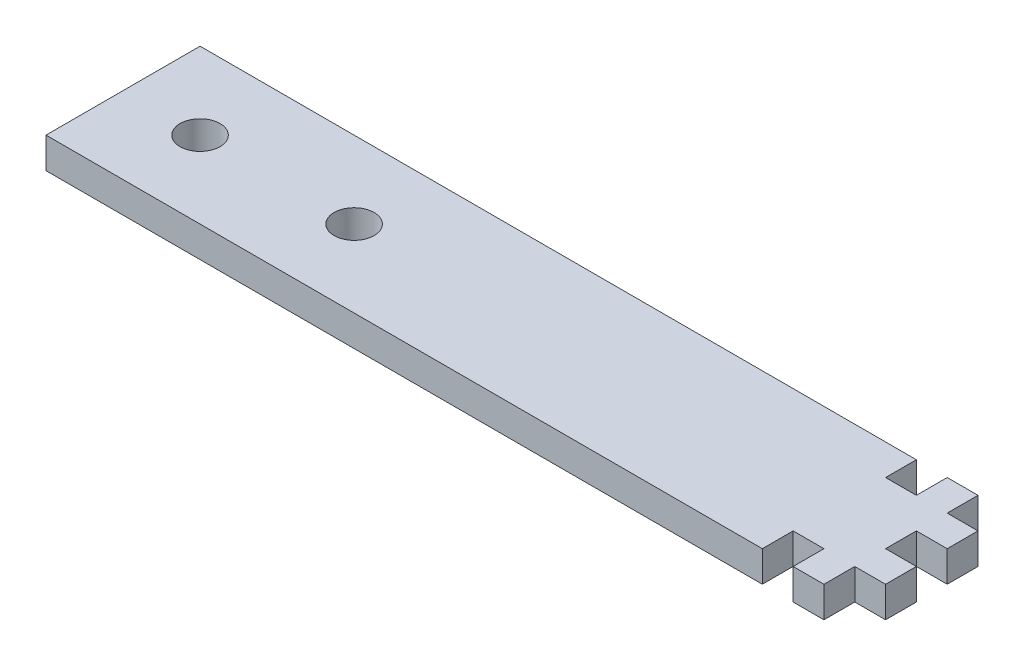
ISO-10303-21;
HEADER;
FILE_DESCRIPTION(('STEP AP214'),'2;1');
FILE_NAME('part.step','',(''),(''),'','','');
FILE_SCHEMA(('AUTOMOTIVE_DESIGN { 1 0 10303 214 1 1 1 1 }'));
ENDSEC;
DATA;
#1=APPLICATION_CONTEXT('core data for automotive mechanical design processes');
#2=APPLICATION_PROTOCOL_DEFINITION('international standard','automotive_design',2000,#1);
#3=PRODUCT_CONTEXT('',#1,'mechanical');
#4=PRODUCT('Part','Part','',(#3));
#5=PRODUCT_RELATED_PRODUCT_CATEGORY('part','',(#4));
#6=PRODUCT_DEFINITION_FORMATION('','',#4);
#7=PRODUCT_DEFINITION_CONTEXT('part definition',#1,'design');
#8=PRODUCT_DEFINITION('design','',#6,#7);
#9=PRODUCT_DEFINITION_SHAPE('','',#8);
#10=(LENGTH_UNIT() NAMED_UNIT(*) SI_UNIT(.MILLI.,.METRE.));
#11=(NAMED_UNIT(*) PLANE_ANGLE_UNIT() SI_UNIT($,.RADIAN.));
#12=(NAMED_UNIT(*) SI_UNIT($,.STERADIAN.) SOLID_ANGLE_UNIT());
#13=UNCERTAINTY_MEASURE_WITH_UNIT(LENGTH_MEASURE(1.E-05),#10,'distance_accuracy_value','');
#14=(GEOMETRIC_REPRESENTATION_CONTEXT(3) GLOBAL_UNCERTAINTY_ASSIGNED_CONTEXT((#13)) GLOBAL_UNIT_ASSIGNED_CONTEXT((#10,
#11,#12)) REPRESENTATION_CONTEXT('',''));
#15=CARTESIAN_POINT('',(0.,0.,0.));
#16=DIRECTION('',(0.,0.,1.));
#17=DIRECTION('',(1.,0.,0.));
#18=AXIS2_PLACEMENT_3D('',#15,#16,#17);
#19=CARTESIAN_POINT('',(0.,2.54,-12.7));
#20=DIRECTION('',(0.,0.,1.));
#21=DIRECTION('',(1.,0.,0.));
#22=AXIS2_PLACEMENT_3D('',#19,#20,#21);
#23=PLANE('',#22);
#24=DIRECTION('',(-1.,0.,0.));
#25=VECTOR('',#24,1.);
#26=CARTESIAN_POINT('',(0.,2.54,-12.7));
#27=LINE('',#26,#25);
#28=CARTESIAN_POINT('',(59.055,2.54,-12.7));
#29=VERTEX_POINT('',#28);
#30=CARTESIAN_POINT('',(0.,2.54,-12.7));
#31=VERTEX_POINT('',#30);
#32=EDGE_CURVE('E330',#29,#31,#27,.T.);
#33=ORIENTED_EDGE('',*,*,#32,.F.);
#34=DIRECTION('',(0.,1.,0.));
#35=VECTOR('',#34,1.);
#36=CARTESIAN_POINT('',(59.055,0.,-12.7));
#37=LINE('',#36,#35);
#38=CARTESIAN_POINT('',(59.055,0.,-12.7));
#39=VERTEX_POINT('',#38);
#40=EDGE_CURVE('E215',#39,#29,#37,.T.);
#41=ORIENTED_EDGE('',*,*,#40,.F.);
#42=DIRECTION('',(-1.,0.,0.));
#43=VECTOR('',#42,1.);
#44=CARTESIAN_POINT('',(0.,0.,-12.7));
#45=LINE('',#44,#43);
#46=CARTESIAN_POINT('',(0.,0.,-12.7));
#47=VERTEX_POINT('',#46);
#48=EDGE_CURVE('E207',#39,#47,#45,.T.);
#49=ORIENTED_EDGE('',*,*,#48,.T.);
#50=DIRECTION('',(0.,-1.,0.));
#51=VECTOR('',#50,1.);
#52=CARTESIAN_POINT('',(0.,2.54,-12.7));
#53=LINE('',#52,#51);
#54=EDGE_CURVE('E54',#31,#47,#53,.T.);
#55=ORIENTED_EDGE('',*,*,#54,.F.);
#56=EDGE_LOOP('',(#33,#41,#49,#55));
#57=FACE_BOUND('',#56,.T.);
#58=ADVANCED_FACE('F46',(#57),#23,.F.);
#59=CARTESIAN_POINT('',(0.,2.54,0.));
#60=DIRECTION('',(0.,0.,-1.));
#61=DIRECTION('',(-1.,0.,0.));
#62=AXIS2_PLACEMENT_3D('',#59,#60,#61);
#63=PLANE('',#62);
#64=DIRECTION('',(1.,0.,0.));
#65=VECTOR('',#64,1.);
#66=CARTESIAN_POINT('',(0.,2.54,0.));
#67=LINE('',#66,#65);
#68=CARTESIAN_POINT('',(61.595,2.54,0.));
#69=VERTEX_POINT('',#68);
#70=CARTESIAN_POINT('',(64.135,2.54,0.));
#71=VERTEX_POINT('',#70);
#72=EDGE_CURVE('E321',#69,#71,#67,.T.);
#73=ORIENTED_EDGE('',*,*,#72,.F.);
#74=DIRECTION('',(0.,1.,0.));
#75=VECTOR('',#74,1.);
#76=CARTESIAN_POINT('',(61.595,0.,0.));
#77=LINE('',#76,#75);
#78=CARTESIAN_POINT('',(61.595,0.,0.));
#79=VERTEX_POINT('',#78);
#80=EDGE_CURVE('E237',#79,#69,#77,.T.);
#81=ORIENTED_EDGE('',*,*,#80,.F.);
#82=DIRECTION('',(1.,0.,0.));
#83=VECTOR('',#82,1.);
#84=CARTESIAN_POINT('',(0.,0.,0.));
#85=LINE('',#84,#83);
#86=CARTESIAN_POINT('',(64.135,0.,0.));
#87=VERTEX_POINT('',#86);
#88=EDGE_CURVE('E336',#79,#87,#85,.T.);
#89=ORIENTED_EDGE('',*,*,#88,.T.);
#90=DIRECTION('',(0.,1.,0.));
#91=VECTOR('',#90,1.);
#92=CARTESIAN_POINT('',(64.135,0.,0.));
#93=LINE('',#92,#91);
#94=EDGE_CURVE('E289',#87,#71,#93,.T.);
#95=ORIENTED_EDGE('',*,*,#94,.T.);
#96=EDGE_LOOP('',(#73,#81,#89,#95));
#97=FACE_BOUND('',#96,.T.);
#98=ADVANCED_FACE('F358',(#97),#63,.F.);
#99=CARTESIAN_POINT('',(66.675,2.54,0.));
#100=DIRECTION('',(-1.,0.,0.));
#101=DIRECTION('',(0.,0.,1.));
#102=AXIS2_PLACEMENT_3D('',#99,#100,#101);
#103=PLANE('',#102);
#104=DIRECTION('',(0.,-1.,0.));
#105=VECTOR('',#104,1.);
#106=CARTESIAN_POINT('',(66.675,3.81,-5.08));
#107=LINE('',#106,#105);
#108=CARTESIAN_POINT('',(66.675,2.54,-5.08));
#109=VERTEX_POINT('',#108);
#110=CARTESIAN_POINT('',(66.675,0.,-5.08));
#111=VERTEX_POINT('',#110);
#112=EDGE_CURVE('E271',#109,#111,#107,.T.);
#113=ORIENTED_EDGE('',*,*,#112,.F.);
#114=DIRECTION('',(0.,0.,-1.));
#115=VECTOR('',#114,1.);
#116=CARTESIAN_POINT('',(66.675,2.54,0.));
#117=LINE('',#116,#115);
#118=CARTESIAN_POINT('',(66.675,2.54,-2.54));
#119=VERTEX_POINT('',#118);
#120=EDGE_CURVE('E327',#119,#109,#117,.T.);
#121=ORIENTED_EDGE('',*,*,#120,.F.);
#122=DIRECTION('',(0.,1.,0.));
#123=VECTOR('',#122,1.);
#124=CARTESIAN_POINT('',(66.675,0.,-2.54));
#125=LINE('',#124,#123);
#126=CARTESIAN_POINT('',(66.675,0.,-2.54));
#127=VERTEX_POINT('',#126);
#128=EDGE_CURVE('E286',#127,#119,#125,.T.);
#129=ORIENTED_EDGE('',*,*,#128,.F.);
#130=DIRECTION('',(0.,0.,-1.));
#131=VECTOR('',#130,1.);
#132=CARTESIAN_POINT('',(66.675,0.,0.));
#133=LINE('',#132,#131);
#134=EDGE_CURVE('E341',#127,#111,#133,.T.);
#135=ORIENTED_EDGE('',*,*,#134,.T.);
#136=EDGE_LOOP('',(#113,#121,#129,#135));
#137=FACE_BOUND('',#136,.T.);
#138=ADVANCED_FACE('F364',(#137),#103,.F.);
#139=DIRECTION('',(0.,-1.,0.));
#140=VECTOR('',#139,1.);
#141=CARTESIAN_POINT('',(66.675,3.81,-7.62));
#142=LINE('',#141,#140);
#143=CARTESIAN_POINT('',(66.675,2.54,-7.62));
#144=VERTEX_POINT('',#143);
#145=CARTESIAN_POINT('',(66.675,0.,-7.62));
#146=VERTEX_POINT('',#145);
#147=EDGE_CURVE('E268',#144,#146,#142,.T.);
#148=ORIENTED_EDGE('',*,*,#147,.T.);
#149=CARTESIAN_POINT('',(66.675,0.,-10.16));
#150=VERTEX_POINT('',#149);
#151=EDGE_CURVE('E340',#146,#150,#133,.T.);
#152=ORIENTED_EDGE('',*,*,#151,.T.);
#153=DIRECTION('',(0.,-1.,0.));
#154=VECTOR('',#153,1.);
#155=CARTESIAN_POINT('',(66.675,3.81,-10.16));
#156=LINE('',#155,#154);
#157=CARTESIAN_POINT('',(66.675,2.54,-10.16));
#158=VERTEX_POINT('',#157);
#159=EDGE_CURVE('E307',#158,#150,#156,.T.);
#160=ORIENTED_EDGE('',*,*,#159,.F.);
#161=EDGE_CURVE('E326',#144,#158,#117,.T.);
#162=ORIENTED_EDGE('',*,*,#161,.F.);
#163=EDGE_LOOP('',(#148,#152,#160,#162));
#164=FACE_BOUND('',#163,.T.);
#165=ADVANCED_FACE('F388',(#164),#103,.F.);
#166=CARTESIAN_POINT('',(0.,2.54,0.));
#167=DIRECTION('',(0.,-1.,0.));
#168=DIRECTION('',(0.,0.,-1.));
#169=AXIS2_PLACEMENT_3D('',#166,#167,#168);
#170=PLANE('',#169);
#171=CARTESIAN_POINT('',(19.05,2.54,-6.35));
#172=DIRECTION('',(0.,1.,0.));
#173=DIRECTION('',(0.,0.,1.));
#174=AXIS2_PLACEMENT_3D('',#171,#172,#173);
#175=CIRCLE('',#174,1.651);
#176=CARTESIAN_POINT('',(19.05,2.54,-4.699));
#177=VERTEX_POINT('',#176);
#178=EDGE_CURVE('E239',#177,#177,#175,.T.);
#179=ORIENTED_EDGE('',*,*,#178,.F.);
#180=EDGE_LOOP('',(#179));
#181=FACE_BOUND('',#180,.T.);
#182=CARTESIAN_POINT('',(6.35,2.54,-6.35));
#183=DIRECTION('',(0.,1.,0.));
#184=DIRECTION('',(0.,0.,1.));
#185=AXIS2_PLACEMENT_3D('',#182,#183,#184);
#186=CIRCLE('',#185,1.651);
#187=CARTESIAN_POINT('',(6.35,2.54,-4.699));
#188=VERTEX_POINT('',#187);
#189=EDGE_CURVE('E248',#188,#188,#186,.T.);
#190=ORIENTED_EDGE('',*,*,#189,.F.);
#191=EDGE_LOOP('',(#190));
#192=FACE_BOUND('',#191,.T.);
#193=DIRECTION('',(1.,0.,0.));
#194=VECTOR('',#193,1.);
#195=CARTESIAN_POINT('',(59.055,2.54,-10.16));
#196=LINE('',#195,#194);
#197=CARTESIAN_POINT('',(59.055,2.54,-10.16));
#198=VERTEX_POINT('',#197);
#199=CARTESIAN_POINT('',(61.595,2.54,-10.16));
#200=VERTEX_POINT('',#199);
#201=EDGE_CURVE('E209',#198,#200,#196,.T.);
#202=ORIENTED_EDGE('',*,*,#201,.F.);
#203=DIRECTION('',(0.,0.,1.));
#204=VECTOR('',#203,1.);
#205=CARTESIAN_POINT('',(59.055,2.54,-12.7));
#206=LINE('',#205,#204);
#207=EDGE_CURVE('E189',#29,#198,#206,.T.);
#208=ORIENTED_EDGE('',*,*,#207,.F.);
#209=ORIENTED_EDGE('',*,*,#32,.T.);
#210=DIRECTION('',(0.,0.,1.));
#211=VECTOR('',#210,1.);
#212=CARTESIAN_POINT('',(0.,2.54,0.));
#213=LINE('',#212,#211);
#214=CARTESIAN_POINT('',(0.,2.54,0.));
#215=VERTEX_POINT('',#214);
#216=EDGE_CURVE('E318',#31,#215,#213,.T.);
#217=ORIENTED_EDGE('',*,*,#216,.T.);
#218=CARTESIAN_POINT('',(59.055,2.54,0.));
#219=VERTEX_POINT('',#218);
#220=EDGE_CURVE('E323',#215,#219,#67,.T.);
#221=ORIENTED_EDGE('',*,*,#220,.T.);
#222=DIRECTION('',(0.,0.,1.));
#223=VECTOR('',#222,1.);
#224=CARTESIAN_POINT('',(59.055,2.54,0.));
#225=LINE('',#224,#223);
#226=CARTESIAN_POINT('',(59.055,2.54,-2.54));
#227=VERTEX_POINT('',#226);
#228=EDGE_CURVE('E69',#227,#219,#225,.T.);
#229=ORIENTED_EDGE('',*,*,#228,.F.);
#230=DIRECTION('',(-1.,0.,0.));
#231=VECTOR('',#230,1.);
#232=CARTESIAN_POINT('',(61.595,2.54,-2.54));
#233=LINE('',#232,#231);
#234=CARTESIAN_POINT('',(61.595,2.54,-2.54));
#235=VERTEX_POINT('',#234);
#236=EDGE_CURVE('E233',#235,#227,#233,.T.);
#237=ORIENTED_EDGE('',*,*,#236,.F.);
#238=DIRECTION('',(0.,0.,-1.));
#239=VECTOR('',#238,1.);
#240=CARTESIAN_POINT('',(61.595,2.54,0.));
#241=LINE('',#240,#239);
#242=EDGE_CURVE('E217',#69,#235,#241,.T.);
#243=ORIENTED_EDGE('',*,*,#242,.F.);
#244=ORIENTED_EDGE('',*,*,#72,.T.);
#245=DIRECTION('',(0.,0.,1.));
#246=VECTOR('',#245,1.);
#247=CARTESIAN_POINT('',(64.135,2.54,0.));
#248=LINE('',#247,#246);
#249=CARTESIAN_POINT('',(64.135,2.54,-2.54));
#250=VERTEX_POINT('',#249);
#251=EDGE_CURVE('E288',#250,#71,#248,.T.);
#252=ORIENTED_EDGE('',*,*,#251,.F.);
#253=DIRECTION('',(-1.,0.,0.));
#254=VECTOR('',#253,1.);
#255=CARTESIAN_POINT('',(0.,2.54,-2.54));
#256=LINE('',#255,#254);
#257=EDGE_CURVE('E296',#119,#250,#256,.T.);
#258=ORIENTED_EDGE('',*,*,#257,.F.);
#259=ORIENTED_EDGE('',*,*,#120,.T.);
#260=DIRECTION('',(1.,0.,0.));
#261=VECTOR('',#260,1.);
#262=CARTESIAN_POINT('',(0.,2.54,-5.08));
#263=LINE('',#262,#261);
#264=CARTESIAN_POINT('',(64.135,2.54,-5.08));
#265=VERTEX_POINT('',#264);
#266=EDGE_CURVE('E277',#265,#109,#263,.T.);
#267=ORIENTED_EDGE('',*,*,#266,.F.);
#268=DIRECTION('',(0.,0.,1.));
#269=VECTOR('',#268,1.);
#270=CARTESIAN_POINT('',(64.135,2.54,0.));
#271=LINE('',#270,#269);
#272=CARTESIAN_POINT('',(64.135,2.54,-7.62));
#273=VERTEX_POINT('',#272);
#274=EDGE_CURVE('E279',#273,#265,#271,.T.);
#275=ORIENTED_EDGE('',*,*,#274,.F.);
#276=DIRECTION('',(-1.,0.,0.));
#277=VECTOR('',#276,1.);
#278=CARTESIAN_POINT('',(0.,2.54,-7.62));
#279=LINE('',#278,#277);
#280=EDGE_CURVE('E275',#144,#273,#279,.T.);
#281=ORIENTED_EDGE('',*,*,#280,.F.);
#282=ORIENTED_EDGE('',*,*,#161,.T.);
#283=DIRECTION('',(1.,0.,0.));
#284=VECTOR('',#283,1.);
#285=CARTESIAN_POINT('',(0.,2.54,-10.16));
#286=LINE('',#285,#284);
#287=CARTESIAN_POINT('',(64.135,2.54,-10.16));
#288=VERTEX_POINT('',#287);
#289=EDGE_CURVE('E312',#288,#158,#286,.T.);
#290=ORIENTED_EDGE('',*,*,#289,.F.);
#291=DIRECTION('',(0.,0.,1.));
#292=VECTOR('',#291,1.);
#293=CARTESIAN_POINT('',(64.135,2.54,0.));
#294=LINE('',#293,#292);
#295=CARTESIAN_POINT('',(64.135,2.54,-12.7));
#296=VERTEX_POINT('',#295);
#297=EDGE_CURVE('E315',#296,#288,#294,.T.);
#298=ORIENTED_EDGE('',*,*,#297,.F.);
#299=CARTESIAN_POINT('',(61.595,2.54,-12.7));
#300=VERTEX_POINT('',#299);
#301=EDGE_CURVE('E331',#296,#300,#27,.T.);
#302=ORIENTED_EDGE('',*,*,#301,.T.);
#303=DIRECTION('',(0.,0.,-1.));
#304=VECTOR('',#303,1.);
#305=CARTESIAN_POINT('',(61.595,2.54,-12.7));
#306=LINE('',#305,#304);
#307=EDGE_CURVE('E61',#200,#300,#306,.T.);
#308=ORIENTED_EDGE('',*,*,#307,.F.);
#309=EDGE_LOOP('',(#202,#208,#209,#217,#221,#229,#237,#243,#244,#252,#258,#259,#267,#275,#281,
#282,#290,#298,#302,#308));
#310=FACE_BOUND('',#309,.T.);
#311=ADVANCED_FACE('F356',(#181,#192,#310),#170,.F.);
#312=CARTESIAN_POINT('',(0.,0.,0.));
#313=DIRECTION('',(0.,-1.,0.));
#314=DIRECTION('',(0.,0.,-1.));
#315=AXIS2_PLACEMENT_3D('',#312,#313,#314);
#316=PLANE('',#315);
#317=DIRECTION('',(0.,0.,1.));
#318=VECTOR('',#317,1.);
#319=CARTESIAN_POINT('',(59.055,0.,-12.7));
#320=LINE('',#319,#318);
#321=CARTESIAN_POINT('',(59.055,0.,-10.16));
#322=VERTEX_POINT('',#321);
#323=EDGE_CURVE('E186',#39,#322,#320,.T.);
#324=ORIENTED_EDGE('',*,*,#323,.T.);
#325=DIRECTION('',(1.,0.,0.));
#326=VECTOR('',#325,1.);
#327=CARTESIAN_POINT('',(59.055,0.,-10.16));
#328=LINE('',#327,#326);
#329=CARTESIAN_POINT('',(61.595,0.,-10.16));
#330=VERTEX_POINT('',#329);
#331=EDGE_CURVE('E197',#322,#330,#328,.T.);
#332=ORIENTED_EDGE('',*,*,#331,.T.);
#333=DIRECTION('',(0.,0.,-1.));
#334=VECTOR('',#333,1.);
#335=CARTESIAN_POINT('',(61.595,0.,-12.7));
#336=LINE('',#335,#334);
#337=CARTESIAN_POINT('',(61.595,0.,-12.7));
#338=VERTEX_POINT('',#337);
#339=EDGE_CURVE('E194',#330,#338,#336,.T.);
#340=ORIENTED_EDGE('',*,*,#339,.T.);
#341=CARTESIAN_POINT('',(64.135,0.,-12.7));
#342=VERTEX_POINT('',#341);
#343=EDGE_CURVE('E322',#342,#338,#45,.T.);
#344=ORIENTED_EDGE('',*,*,#343,.F.);
#345=DIRECTION('',(0.,0.,1.));
#346=VECTOR('',#345,1.);
#347=CARTESIAN_POINT('',(64.135,0.,0.));
#348=LINE('',#347,#346);
#349=CARTESIAN_POINT('',(64.135,0.,-10.16));
#350=VERTEX_POINT('',#349);
#351=EDGE_CURVE('E298',#342,#350,#348,.T.);
#352=ORIENTED_EDGE('',*,*,#351,.T.);
#353=DIRECTION('',(1.,0.,0.));
#354=VECTOR('',#353,1.);
#355=CARTESIAN_POINT('',(0.,0.,-10.16));
#356=LINE('',#355,#354);
#357=EDGE_CURVE('E301',#350,#150,#356,.T.);
#358=ORIENTED_EDGE('',*,*,#357,.T.);
#359=ORIENTED_EDGE('',*,*,#151,.F.);
#360=DIRECTION('',(-1.,0.,0.));
#361=VECTOR('',#360,1.);
#362=CARTESIAN_POINT('',(0.,0.,-7.62));
#363=LINE('',#362,#361);
#364=CARTESIAN_POINT('',(64.135,0.,-7.62));
#365=VERTEX_POINT('',#364);
#366=EDGE_CURVE('E262',#146,#365,#363,.T.);
#367=ORIENTED_EDGE('',*,*,#366,.T.);
#368=DIRECTION('',(0.,0.,1.));
#369=VECTOR('',#368,1.);
#370=CARTESIAN_POINT('',(64.135,0.,0.));
#371=LINE('',#370,#369);
#372=CARTESIAN_POINT('',(64.135,0.,-5.08));
#373=VERTEX_POINT('',#372);
#374=EDGE_CURVE('E254',#365,#373,#371,.T.);
#375=ORIENTED_EDGE('',*,*,#374,.T.);
#376=DIRECTION('',(1.,0.,0.));
#377=VECTOR('',#376,1.);
#378=CARTESIAN_POINT('',(0.,0.,-5.08));
#379=LINE('',#378,#377);
#380=EDGE_CURVE('E259',#373,#111,#379,.T.);
#381=ORIENTED_EDGE('',*,*,#380,.T.);
#382=ORIENTED_EDGE('',*,*,#134,.F.);
#383=DIRECTION('',(1.,0.,0.));
#384=VECTOR('',#383,1.);
#385=CARTESIAN_POINT('',(0.,0.,-2.54));
#386=LINE('',#385,#384);
#387=CARTESIAN_POINT('',(64.135,0.,-2.54));
#388=VERTEX_POINT('',#387);
#389=EDGE_CURVE('E281',#388,#127,#386,.T.);
#390=ORIENTED_EDGE('',*,*,#389,.F.);
#391=DIRECTION('',(0.,0.,-1.));
#392=VECTOR('',#391,1.);
#393=CARTESIAN_POINT('',(64.135,0.,0.));
#394=LINE('',#393,#392);
#395=EDGE_CURVE('E283',#87,#388,#394,.T.);
#396=ORIENTED_EDGE('',*,*,#395,.F.);
#397=ORIENTED_EDGE('',*,*,#88,.F.);
#398=DIRECTION('',(0.,0.,-1.));
#399=VECTOR('',#398,1.);
#400=CARTESIAN_POINT('',(61.595,0.,0.));
#401=LINE('',#400,#399);
#402=CARTESIAN_POINT('',(61.595,0.,-2.54));
#403=VERTEX_POINT('',#402);
#404=EDGE_CURVE('E221',#79,#403,#401,.T.);
#405=ORIENTED_EDGE('',*,*,#404,.T.);
#406=DIRECTION('',(-1.,0.,0.));
#407=VECTOR('',#406,1.);
#408=CARTESIAN_POINT('',(61.595,0.,-2.54));
#409=LINE('',#408,#407);
#410=CARTESIAN_POINT('',(59.055,0.,-2.54));
#411=VERTEX_POINT('',#410);
#412=EDGE_CURVE('E224',#403,#411,#409,.T.);
#413=ORIENTED_EDGE('',*,*,#412,.T.);
#414=DIRECTION('',(0.,0.,1.));
#415=VECTOR('',#414,1.);
#416=CARTESIAN_POINT('',(59.055,0.,0.));
#417=LINE('',#416,#415);
#418=CARTESIAN_POINT('',(59.055,0.,0.));
#419=VERTEX_POINT('',#418);
#420=EDGE_CURVE('E227',#411,#419,#417,.T.);
#421=ORIENTED_EDGE('',*,*,#420,.T.);
#422=CARTESIAN_POINT('',(0.,0.,0.));
#423=VERTEX_POINT('',#422);
#424=EDGE_CURVE('E337',#423,#419,#85,.T.);
#425=ORIENTED_EDGE('',*,*,#424,.F.);
#426=DIRECTION('',(0.,0.,1.));
#427=VECTOR('',#426,1.);
#428=CARTESIAN_POINT('',(0.,0.,0.));
#429=LINE('',#428,#427);
#430=EDGE_CURVE('E317',#47,#423,#429,.T.);
#431=ORIENTED_EDGE('',*,*,#430,.F.);
#432=ORIENTED_EDGE('',*,*,#48,.F.);
#433=EDGE_LOOP('',(#324,#332,#340,#344,#352,#358,#359,#367,#375,#381,#382,#390,#396,#397,#405,
#413,#421,#425,#431,#432));
#434=FACE_BOUND('',#433,.T.);
#435=CARTESIAN_POINT('',(19.05,0.,-6.35));
#436=DIRECTION('',(0.,1.,0.));
#437=DIRECTION('',(0.,0.,1.));
#438=AXIS2_PLACEMENT_3D('',#435,#436,#437);
#439=CIRCLE('',#438,1.651);
#440=CARTESIAN_POINT('',(19.05,0.,-4.699));
#441=VERTEX_POINT('',#440);
#442=EDGE_CURVE('E245',#441,#441,#439,.T.);
#443=ORIENTED_EDGE('',*,*,#442,.T.);
#444=EDGE_LOOP('',(#443));
#445=FACE_BOUND('',#444,.T.);
#446=CARTESIAN_POINT('',(6.35,0.,-6.35));
#447=DIRECTION('',(0.,1.,0.));
#448=DIRECTION('',(0.,0.,1.));
#449=AXIS2_PLACEMENT_3D('',#446,#447,#448);
#450=CIRCLE('',#449,1.651);
#451=CARTESIAN_POINT('',(6.35,0.,-4.699));
#452=VERTEX_POINT('',#451);
#453=EDGE_CURVE('E251',#452,#452,#450,.T.);
#454=ORIENTED_EDGE('',*,*,#453,.T.);
#455=EDGE_LOOP('',(#454));
#456=FACE_BOUND('',#455,.T.);
#457=ADVANCED_FACE('F204',(#434,#445,#456),#316,.T.);
#458=ORIENTED_EDGE('',*,*,#424,.T.);
#459=DIRECTION('',(0.,1.,0.));
#460=VECTOR('',#459,1.);
#461=CARTESIAN_POINT('',(59.055,0.,0.));
#462=LINE('',#461,#460);
#463=EDGE_CURVE('E240',#419,#219,#462,.T.);
#464=ORIENTED_EDGE('',*,*,#463,.T.);
#465=ORIENTED_EDGE('',*,*,#220,.F.);
#466=DIRECTION('',(0.,-1.,0.));
#467=VECTOR('',#466,1.);
#468=CARTESIAN_POINT('',(0.,2.54,0.));
#469=LINE('',#468,#467);
#470=EDGE_CURVE('E14',#215,#423,#469,.T.);
#471=ORIENTED_EDGE('',*,*,#470,.T.);
#472=EDGE_LOOP('',(#458,#464,#465,#471));
#473=FACE_BOUND('',#472,.T.);
#474=ADVANCED_FACE('F354',(#473),#63,.F.);
#475=ORIENTED_EDGE('',*,*,#343,.T.);
#476=DIRECTION('',(0.,1.,0.));
#477=VECTOR('',#476,1.);
#478=CARTESIAN_POINT('',(61.595,0.,-12.7));
#479=LINE('',#478,#477);
#480=EDGE_CURVE('E218',#338,#300,#479,.T.);
#481=ORIENTED_EDGE('',*,*,#480,.T.);
#482=ORIENTED_EDGE('',*,*,#301,.F.);
#483=DIRECTION('',(0.,-1.,0.));
#484=VECTOR('',#483,1.);
#485=CARTESIAN_POINT('',(64.135,3.81,-12.7));
#486=LINE('',#485,#484);
#487=EDGE_CURVE('E304',#296,#342,#486,.T.);
#488=ORIENTED_EDGE('',*,*,#487,.T.);
#489=EDGE_LOOP('',(#475,#481,#482,#488));
#490=FACE_BOUND('',#489,.T.);
#491=ADVANCED_FACE('F360',(#490),#23,.F.);
#492=CARTESIAN_POINT('',(0.,2.54,0.));
#493=DIRECTION('',(1.,0.,0.));
#494=DIRECTION('',(0.,0.,-1.));
#495=AXIS2_PLACEMENT_3D('',#492,#493,#494);
#496=PLANE('',#495);
#497=ORIENTED_EDGE('',*,*,#430,.T.);
#498=ORIENTED_EDGE('',*,*,#470,.F.);
#499=ORIENTED_EDGE('',*,*,#216,.F.);
#500=ORIENTED_EDGE('',*,*,#54,.T.);
#501=EDGE_LOOP('',(#497,#498,#499,#500));
#502=FACE_BOUND('',#501,.T.);
#503=ADVANCED_FACE('F48',(#502),#496,.F.);
#504=CARTESIAN_POINT('',(64.135,3.81,0.));
#505=DIRECTION('',(1.,0.,0.));
#506=DIRECTION('',(0.,0.,-1.));
#507=AXIS2_PLACEMENT_3D('',#504,#505,#506);
#508=PLANE('',#507);
#509=ORIENTED_EDGE('',*,*,#297,.T.);
#510=DIRECTION('',(0.,-1.,0.));
#511=VECTOR('',#510,1.);
#512=CARTESIAN_POINT('',(64.135,3.81,-10.16));
#513=LINE('',#512,#511);
#514=EDGE_CURVE('E310',#288,#350,#513,.T.);
#515=ORIENTED_EDGE('',*,*,#514,.T.);
#516=ORIENTED_EDGE('',*,*,#351,.F.);
#517=ORIENTED_EDGE('',*,*,#487,.F.);
#518=EDGE_LOOP('',(#509,#515,#516,#517));
#519=FACE_BOUND('',#518,.T.);
#520=ADVANCED_FACE('F374',(#519),#508,.T.);
#521=CARTESIAN_POINT('',(0.,3.81,-10.16));
#522=DIRECTION('',(0.,0.,-1.));
#523=DIRECTION('',(-1.,0.,0.));
#524=AXIS2_PLACEMENT_3D('',#521,#522,#523);
#525=PLANE('',#524);
#526=ORIENTED_EDGE('',*,*,#289,.T.);
#527=ORIENTED_EDGE('',*,*,#159,.T.);
#528=ORIENTED_EDGE('',*,*,#357,.F.);
#529=ORIENTED_EDGE('',*,*,#514,.F.);
#530=EDGE_LOOP('',(#526,#527,#528,#529));
#531=FACE_BOUND('',#530,.T.);
#532=ADVANCED_FACE('F384',(#531),#525,.T.);
#533=CARTESIAN_POINT('',(0.,0.,-2.54));
#534=DIRECTION('',(0.,0.,1.));
#535=DIRECTION('',(1.,0.,0.));
#536=AXIS2_PLACEMENT_3D('',#533,#534,#535);
#537=PLANE('',#536);
#538=ORIENTED_EDGE('',*,*,#257,.T.);
#539=DIRECTION('',(0.,1.,0.));
#540=VECTOR('',#539,1.);
#541=CARTESIAN_POINT('',(64.135,0.,-2.54));
#542=LINE('',#541,#540);
#543=EDGE_CURVE('E285',#388,#250,#542,.T.);
#544=ORIENTED_EDGE('',*,*,#543,.F.);
#545=ORIENTED_EDGE('',*,*,#389,.T.);
#546=ORIENTED_EDGE('',*,*,#128,.T.);
#547=EDGE_LOOP('',(#538,#544,#545,#546));
#548=FACE_BOUND('',#547,.T.);
#549=ADVANCED_FACE('F410',(#548),#537,.T.);
#550=CARTESIAN_POINT('',(64.135,0.,0.));
#551=DIRECTION('',(1.,0.,0.));
#552=DIRECTION('',(0.,0.,-1.));
#553=AXIS2_PLACEMENT_3D('',#550,#551,#552);
#554=PLANE('',#553);
#555=ORIENTED_EDGE('',*,*,#251,.T.);
#556=ORIENTED_EDGE('',*,*,#94,.F.);
#557=ORIENTED_EDGE('',*,*,#395,.T.);
#558=ORIENTED_EDGE('',*,*,#543,.T.);
#559=EDGE_LOOP('',(#555,#556,#557,#558));
#560=FACE_BOUND('',#559,.T.);
#561=ADVANCED_FACE('F417',(#560),#554,.T.);
#562=CARTESIAN_POINT('',(64.135,3.81,0.));
#563=DIRECTION('',(1.,0.,0.));
#564=DIRECTION('',(0.,0.,-1.));
#565=AXIS2_PLACEMENT_3D('',#562,#563,#564);
#566=PLANE('',#565);
#567=ORIENTED_EDGE('',*,*,#274,.T.);
#568=DIRECTION('',(0.,-1.,0.));
#569=VECTOR('',#568,1.);
#570=CARTESIAN_POINT('',(64.135,3.81,-5.08));
#571=LINE('',#570,#569);
#572=EDGE_CURVE('E273',#265,#373,#571,.T.);
#573=ORIENTED_EDGE('',*,*,#572,.T.);
#574=ORIENTED_EDGE('',*,*,#374,.F.);
#575=DIRECTION('',(0.,-1.,0.));
#576=VECTOR('',#575,1.);
#577=CARTESIAN_POINT('',(64.135,3.81,-7.62));
#578=LINE('',#577,#576);
#579=EDGE_CURVE('E265',#273,#365,#578,.T.);
#580=ORIENTED_EDGE('',*,*,#579,.F.);
#581=EDGE_LOOP('',(#567,#573,#574,#580));
#582=FACE_BOUND('',#581,.T.);
#583=ADVANCED_FACE('F398',(#582),#566,.T.);
#584=CARTESIAN_POINT('',(0.,3.81,-5.08));
#585=DIRECTION('',(0.,0.,-1.));
#586=DIRECTION('',(-1.,0.,0.));
#587=AXIS2_PLACEMENT_3D('',#584,#585,#586);
#588=PLANE('',#587);
#589=ORIENTED_EDGE('',*,*,#266,.T.);
#590=ORIENTED_EDGE('',*,*,#112,.T.);
#591=ORIENTED_EDGE('',*,*,#380,.F.);
#592=ORIENTED_EDGE('',*,*,#572,.F.);
#593=EDGE_LOOP('',(#589,#590,#591,#592));
#594=FACE_BOUND('',#593,.T.);
#595=ADVANCED_FACE('F401',(#594),#588,.T.);
#596=CARTESIAN_POINT('',(0.,3.81,-7.62));
#597=DIRECTION('',(0.,0.,1.));
#598=DIRECTION('',(1.,0.,0.));
#599=AXIS2_PLACEMENT_3D('',#596,#597,#598);
#600=PLANE('',#599);
#601=ORIENTED_EDGE('',*,*,#280,.T.);
#602=ORIENTED_EDGE('',*,*,#579,.T.);
#603=ORIENTED_EDGE('',*,*,#366,.F.);
#604=ORIENTED_EDGE('',*,*,#147,.F.);
#605=EDGE_LOOP('',(#601,#602,#603,#604));
#606=FACE_BOUND('',#605,.T.);
#607=ADVANCED_FACE('F392',(#606),#600,.T.);
#608=CARTESIAN_POINT('',(6.35,0.,-6.35));
#609=DIRECTION('',(0.,1.,0.));
#610=DIRECTION('',(0.,0.,1.));
#611=AXIS2_PLACEMENT_3D('',#608,#609,#610);
#612=CYLINDRICAL_SURFACE('',#611,1.651);
#613=ORIENTED_EDGE('',*,*,#453,.F.);
#614=EDGE_LOOP('',(#613));
#615=FACE_BOUND('',#614,.T.);
#616=ORIENTED_EDGE('',*,*,#189,.T.);
#617=EDGE_LOOP('',(#616));
#618=FACE_BOUND('',#617,.T.);
#619=ADVANCED_FACE('F442',(#615,#618),#612,.F.);
#620=CARTESIAN_POINT('',(19.05,0.,-6.35));
#621=DIRECTION('',(0.,1.,0.));
#622=DIRECTION('',(0.,0.,1.));
#623=AXIS2_PLACEMENT_3D('',#620,#621,#622);
#624=CYLINDRICAL_SURFACE('',#623,1.651);
#625=ORIENTED_EDGE('',*,*,#442,.F.);
#626=EDGE_LOOP('',(#625));
#627=FACE_BOUND('',#626,.T.);
#628=ORIENTED_EDGE('',*,*,#178,.T.);
#629=EDGE_LOOP('',(#628));
#630=FACE_BOUND('',#629,.T.);
#631=ADVANCED_FACE('F435',(#627,#630),#624,.F.);
#632=CARTESIAN_POINT('',(61.595,0.,0.));
#633=DIRECTION('',(1.,0.,0.));
#634=DIRECTION('',(0.,0.,-1.));
#635=AXIS2_PLACEMENT_3D('',#632,#633,#634);
#636=PLANE('',#635);
#637=ORIENTED_EDGE('',*,*,#242,.T.);
#638=DIRECTION('',(0.,1.,0.));
#639=VECTOR('',#638,1.);
#640=CARTESIAN_POINT('',(61.595,0.,-2.54));
#641=LINE('',#640,#639);
#642=EDGE_CURVE('E230',#403,#235,#641,.T.);
#643=ORIENTED_EDGE('',*,*,#642,.F.);
#644=ORIENTED_EDGE('',*,*,#404,.F.);
#645=ORIENTED_EDGE('',*,*,#80,.T.);
#646=EDGE_LOOP('',(#637,#643,#644,#645));
#647=FACE_BOUND('',#646,.T.);
#648=ADVANCED_FACE('F423',(#647),#636,.F.);
#649=CARTESIAN_POINT('',(59.055,0.,0.));
#650=DIRECTION('',(-1.,0.,0.));
#651=DIRECTION('',(0.,0.,1.));
#652=AXIS2_PLACEMENT_3D('',#649,#650,#651);
#653=PLANE('',#652);
#654=ORIENTED_EDGE('',*,*,#228,.T.);
#655=ORIENTED_EDGE('',*,*,#463,.F.);
#656=ORIENTED_EDGE('',*,*,#420,.F.);
#657=DIRECTION('',(0.,1.,0.));
#658=VECTOR('',#657,1.);
#659=CARTESIAN_POINT('',(59.055,0.,-2.54));
#660=LINE('',#659,#658);
#661=EDGE_CURVE('E242',#411,#227,#660,.T.);
#662=ORIENTED_EDGE('',*,*,#661,.T.);
#663=EDGE_LOOP('',(#654,#655,#656,#662));
#664=FACE_BOUND('',#663,.T.);
#665=ADVANCED_FACE('F427',(#664),#653,.F.);
#666=CARTESIAN_POINT('',(61.595,0.,-2.54));
#667=DIRECTION('',(0.,0.,-1.));
#668=DIRECTION('',(-1.,0.,0.));
#669=AXIS2_PLACEMENT_3D('',#666,#667,#668);
#670=PLANE('',#669);
#671=ORIENTED_EDGE('',*,*,#236,.T.);
#672=ORIENTED_EDGE('',*,*,#661,.F.);
#673=ORIENTED_EDGE('',*,*,#412,.F.);
#674=ORIENTED_EDGE('',*,*,#642,.T.);
#675=EDGE_LOOP('',(#671,#672,#673,#674));
#676=FACE_BOUND('',#675,.T.);
#677=ADVANCED_FACE('F426',(#676),#670,.F.);
#678=CARTESIAN_POINT('',(59.055,0.,-12.7));
#679=DIRECTION('',(-1.,0.,0.));
#680=DIRECTION('',(0.,0.,1.));
#681=AXIS2_PLACEMENT_3D('',#678,#679,#680);
#682=PLANE('',#681);
#683=ORIENTED_EDGE('',*,*,#207,.T.);
#684=DIRECTION('',(0.,1.,0.));
#685=VECTOR('',#684,1.);
#686=CARTESIAN_POINT('',(59.055,0.,-10.16));
#687=LINE('',#686,#685);
#688=EDGE_CURVE('E182',#322,#198,#687,.T.);
#689=ORIENTED_EDGE('',*,*,#688,.F.);
#690=ORIENTED_EDGE('',*,*,#323,.F.);
#691=ORIENTED_EDGE('',*,*,#40,.T.);
#692=EDGE_LOOP('',(#683,#689,#690,#691));
#693=FACE_BOUND('',#692,.T.);
#694=ADVANCED_FACE('F184',(#693),#682,.F.);
#695=CARTESIAN_POINT('',(61.595,0.,-12.7));
#696=DIRECTION('',(1.,0.,0.));
#697=DIRECTION('',(0.,0.,-1.));
#698=AXIS2_PLACEMENT_3D('',#695,#696,#697);
#699=PLANE('',#698);
#700=ORIENTED_EDGE('',*,*,#307,.T.);
#701=ORIENTED_EDGE('',*,*,#480,.F.);
#702=ORIENTED_EDGE('',*,*,#339,.F.);
#703=DIRECTION('',(0.,1.,0.));
#704=VECTOR('',#703,1.);
#705=CARTESIAN_POINT('',(61.595,0.,-10.16));
#706=LINE('',#705,#704);
#707=EDGE_CURVE('E193',#330,#200,#706,.T.);
#708=ORIENTED_EDGE('',*,*,#707,.T.);
#709=EDGE_LOOP('',(#700,#701,#702,#708));
#710=FACE_BOUND('',#709,.T.);
#711=ADVANCED_FACE('F377',(#710),#699,.F.);
#712=CARTESIAN_POINT('',(59.055,0.,-10.16));
#713=DIRECTION('',(0.,0.,1.));
#714=DIRECTION('',(1.,0.,0.));
#715=AXIS2_PLACEMENT_3D('',#712,#713,#714);
#716=PLANE('',#715);
#717=ORIENTED_EDGE('',*,*,#201,.T.);
#718=ORIENTED_EDGE('',*,*,#707,.F.);
#719=ORIENTED_EDGE('',*,*,#331,.F.);
#720=ORIENTED_EDGE('',*,*,#688,.T.);
#721=EDGE_LOOP('',(#717,#718,#719,#720));
#722=FACE_BOUND('',#721,.T.);
#723=ADVANCED_FACE('F198',(#722),#716,.F.);
#724=CLOSED_SHELL('',(#58,#98,#138,#165,#311,#457,#474,#491,#503,#520,#532,#549,#561,#583,#595,
#607,#619,#631,#648,#665,#677,#694,#711,#723));
#725=MANIFOLD_SOLID_BREP('B2',#724);
#726=ADVANCED_BREP_SHAPE_REPRESENTATION('',(#18,#725),#14);
#727=SHAPE_DEFINITION_REPRESENTATION(#9,#726);
ENDSEC;
END-ISO-10303-21;
